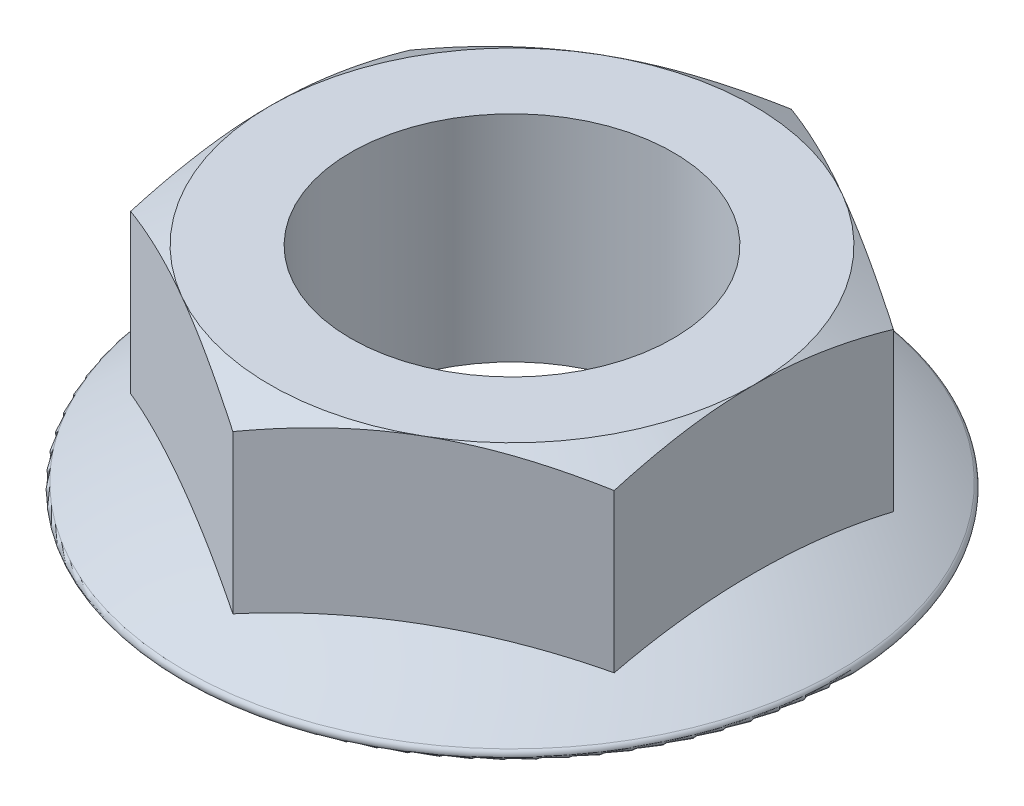
ISO-10303-21;
HEADER;
FILE_DESCRIPTION(('STEP AP214'),'2;1');
FILE_NAME('part.step','',(''),(''),'','','');
FILE_SCHEMA(('AUTOMOTIVE_DESIGN { 1 0 10303 214 1 1 1 1 }'));
ENDSEC;
DATA;
#1=APPLICATION_CONTEXT('core data for automotive mechanical design processes');
#2=APPLICATION_PROTOCOL_DEFINITION('international standard','automotive_design',2000,#1);
#3=PRODUCT_CONTEXT('',#1,'mechanical');
#4=PRODUCT('Part','Part','',(#3));
#5=PRODUCT_RELATED_PRODUCT_CATEGORY('part','',(#4));
#6=PRODUCT_DEFINITION_FORMATION('','',#4);
#7=PRODUCT_DEFINITION_CONTEXT('part definition',#1,'design');
#8=PRODUCT_DEFINITION('design','',#6,#7);
#9=PRODUCT_DEFINITION_SHAPE('','',#8);
#10=(LENGTH_UNIT() NAMED_UNIT(*) SI_UNIT(.MILLI.,.METRE.));
#11=(NAMED_UNIT(*) PLANE_ANGLE_UNIT() SI_UNIT($,.RADIAN.));
#12=(NAMED_UNIT(*) SI_UNIT($,.STERADIAN.) SOLID_ANGLE_UNIT());
#13=UNCERTAINTY_MEASURE_WITH_UNIT(LENGTH_MEASURE(1.E-05),#10,'distance_accuracy_value','');
#14=(GEOMETRIC_REPRESENTATION_CONTEXT(3) GLOBAL_UNCERTAINTY_ASSIGNED_CONTEXT((#13)) GLOBAL_UNIT_ASSIGNED_CONTEXT((#10,
#11,#12)) REPRESENTATION_CONTEXT('',''));
#15=CARTESIAN_POINT('',(0.,0.,0.));
#16=DIRECTION('',(0.,0.,1.));
#17=DIRECTION('',(1.,0.,0.));
#18=AXIS2_PLACEMENT_3D('',#15,#16,#17);
#19=CARTESIAN_POINT('',(-22.4999999999999,20.,12.9903810567669));
#20=DIRECTION('',(0.499999999999995,0.,-0.866025403784441));
#21=DIRECTION('',(-0.866025403784441,0.,-0.499999999999995));
#22=AXIS2_PLACEMENT_3D('',#19,#20,#21);
#23=PLANE('',#22);
#24=CARTESIAN_POINT('',(-22.5001999999999,17.9903143896555,12.990265586713));
#25=CARTESIAN_POINT('',(-22.0056596846795,18.1551492707593,13.2757885708883));
#26=CARTESIAN_POINT('',(-21.5091903987604,18.3125041584607,13.5624252467581));
#27=CARTESIAN_POINT('',(-20.512270737912,18.6101747825265,14.1379970813094));
#28=CARTESIAN_POINT('',(-20.0118191109476,18.7504849147612,14.4269329628537));
#29=CARTESIAN_POINT('',(-19.0059568955597,19.0121827394149,15.0076677836755));
#30=CARTESIAN_POINT('',(-18.5005374245994,19.1335252438812,15.2994718512881));
#31=CARTESIAN_POINT('',(-17.4862080086851,19.3546738156916,15.8850952126132));
#32=CARTESIAN_POINT('',(-16.9772984166631,19.4544820284597,16.1789143025603));
#33=CARTESIAN_POINT('',(-15.9689969145759,19.6283253044473,16.7610574462146));
#34=CARTESIAN_POINT('',(-15.4696797954965,19.7029352669185,17.0493383193261));
#35=CARTESIAN_POINT('',(-14.4687576454326,19.8280391846674,17.6272209921033));
#36=CARTESIAN_POINT('',(-13.9671525705958,19.8785326757383,17.9168228170872));
#37=CARTESIAN_POINT('',(-12.9630998176581,19.954128715289,18.4965129442764));
#38=CARTESIAN_POINT('',(-12.4606538548353,19.9792614354897,18.7866002561654));
#39=CARTESIAN_POINT('',(-11.4552982591452,20.0035954599864,19.3670425799683));
#40=CARTESIAN_POINT('',(-10.9523886410859,20.0027975655861,19.6573975833329));
#41=CARTESIAN_POINT('',(-10.0121905167877,19.9770814657185,20.200221223488));
#42=CARTESIAN_POINT('',(-9.57483504956026,19.9552991118006,20.4527285202234));
#43=CARTESIAN_POINT('',(-8.70116824358604,19.892536574804,20.9571402858346));
#44=CARTESIAN_POINT('',(-8.26485688997443,19.8515566666916,21.2090447632928));
#45=CARTESIAN_POINT('',(-7.39343951507723,19.7511092481864,21.7121578192662));
#46=CARTESIAN_POINT('',(-6.95833494415003,19.6916250199365,21.9633655604166));
#47=CARTESIAN_POINT('',(-6.09020916212544,19.5552217340813,22.464578214359));
#48=CARTESIAN_POINT('',(-5.6571879422089,19.4783027503464,22.7145831322426));
#49=CARTESIAN_POINT('',(-4.34262771135145,19.2194196562896,23.4735448353941));
#50=CARTESIAN_POINT('',(-3.46482360522337,19.011627893702,23.9803452723629));
#51=CARTESIAN_POINT('',(-2.15781149074756,18.6578721503226,24.7349490684896));
#52=CARTESIAN_POINT('',(-1.72413098376757,18.5330695175296,24.9853346259368));
#53=CARTESIAN_POINT('',(-0.859769681101053,18.2708295210671,25.4843738567084));
#54=CARTESIAN_POINT('',(-0.429088076540874,18.1333957185273,25.7330279970363));
#55=CARTESIAN_POINT('',(0.000199999999999925,17.9903143896555,25.980877583587));
#56=B_SPLINE_CURVE_WITH_KNOTS('',3,(#24,#25,#26,#27,#28,#29,#30,#31,#32,#33,#34,#35,#36,#37,#38,
#39,#40,#41,#42,#43,#44,#45,#46,#47,#48,#49,#50,#51,#52,#53,#54,#55),.UNSPECIFIED.,.F.,.F.,(4,2,
2,2,2,2,2,2,2,2,2,2,2,2,2,4),(0.,1.78312722203929,3.56683913913433,5.35473780165091,
7.14245825659311,8.88609109738607,10.6297574992032,12.3713470058018,14.1128826941264,
15.6289689473497,17.1450334863601,18.6624717220613,20.1799035285481,23.2816076138778,
24.8297579454586,26.3774731352148),.UNSPECIFIED.);
#57=CARTESIAN_POINT('',(-22.4999999999999,17.9903810567666,12.9903810567669));
#58=VERTEX_POINT('',#57);
#59=CARTESIAN_POINT('',(-11.2499999999999,20.,19.48557158515));
#60=VERTEX_POINT('',#59);
#61=EDGE_CURVE('E214',#58,#60,#56,.T.);
#62=ORIENTED_EDGE('',*,*,#61,.F.);
#63=DIRECTION('',(0.,-1.,0.));
#64=VECTOR('',#63,1.);
#65=CARTESIAN_POINT('',(-22.4999999999999,20.,12.9903810567669));
#66=LINE('',#65,#64);
#67=CARTESIAN_POINT('',(-22.4999999999999,3.29746895120064,12.9903810567669));
#68=VERTEX_POINT('',#67);
#69=EDGE_CURVE('E237',#58,#68,#66,.T.);
#70=ORIENTED_EDGE('',*,*,#69,.T.);
#71=CARTESIAN_POINT('',(-11.2499999999999,-50.7858001807592,19.48557158515));
#72=DIRECTION('',(0.499999999999995,0.,-0.866025403784441));
#73=DIRECTION('',(-0.866025403784441,0.,-0.499999999999995));
#74=AXIS2_PLACEMENT_3D('',#71,#72,#73);
#75=CIRCLE('',#74,55.6214886532174);
#76=CARTESIAN_POINT('',(0.,3.29746895120063,25.9807621135332));
#77=VERTEX_POINT('',#76);
#78=EDGE_CURVE('E234',#77,#68,#75,.F.);
#79=ORIENTED_EDGE('',*,*,#78,.F.);
#80=DIRECTION('',(0.,-1.,0.));
#81=VECTOR('',#80,1.);
#82=CARTESIAN_POINT('',(0.,20.,25.9807621135332));
#83=LINE('',#82,#81);
#84=CARTESIAN_POINT('',(0.,17.9903810567666,25.9807621135332));
#85=VERTEX_POINT('',#84);
#86=EDGE_CURVE('E246',#85,#77,#83,.T.);
#87=ORIENTED_EDGE('',*,*,#86,.F.);
#88=EDGE_CURVE('E208',#60,#85,#56,.T.);
#89=ORIENTED_EDGE('',*,*,#88,.F.);
#90=EDGE_LOOP('',(#62,#70,#79,#87,#89));
#91=FACE_BOUND('',#90,.T.);
#92=ADVANCED_FACE('F37',(#91),#23,.F.);
#93=CARTESIAN_POINT('',(0.,20.,25.9807621135332));
#94=DIRECTION('',(-0.500000000000001,0.,-0.866025403784438));
#95=DIRECTION('',(-0.866025403784438,0.,0.500000000000001));
#96=AXIS2_PLACEMENT_3D('',#93,#94,#95);
#97=PLANE('',#96);
#98=CARTESIAN_POINT('',(-0.000200000000000414,17.9903143896555,25.980877583587));
#99=CARTESIAN_POINT('',(0.494340315320355,18.1551492707593,25.6953545994117));
#100=CARTESIAN_POINT('',(0.990809601239474,18.3125041584607,25.4087179235419));
#101=CARTESIAN_POINT('',(1.98772926208786,18.6101747825265,24.8331460889907));
#102=CARTESIAN_POINT('',(2.48818088905228,18.7504849147612,24.5442102074464));
#103=CARTESIAN_POINT('',(3.49404310444017,19.0121827394149,23.9634753866245));
#104=CARTESIAN_POINT('',(3.99946257540047,19.1335252438812,23.6716713190119));
#105=CARTESIAN_POINT('',(5.01379199131473,19.3546738156916,23.0860479576868));
#106=CARTESIAN_POINT('',(5.52270158333676,19.4544820284597,22.7922288677397));
#107=CARTESIAN_POINT('',(6.53100308542396,19.6283253044474,22.2100857240854));
#108=CARTESIAN_POINT('',(7.03032020450329,19.7029352669186,21.9218048509739));
#109=CARTESIAN_POINT('',(8.03124235456724,19.8280391846674,21.3439221781966));
#110=CARTESIAN_POINT('',(8.53284742940406,19.8785326757383,21.0543203532127));
#111=CARTESIAN_POINT('',(9.53690018234171,19.954128715289,20.4746302260236));
#112=CARTESIAN_POINT('',(10.0393461451645,19.9792614354898,20.1845429141346));
#113=CARTESIAN_POINT('',(11.0447017408546,20.0035954599864,19.6041005903316));
#114=CARTESIAN_POINT('',(11.5476113589139,20.0027975655861,19.313745586967));
#115=CARTESIAN_POINT('',(12.4878094832121,19.9770814657186,18.7709219468119));
#116=CARTESIAN_POINT('',(12.9251649504396,19.9552991118006,18.5184146500766));
#117=CARTESIAN_POINT('',(13.7988317564138,19.8925365748041,18.0140028844653));
#118=CARTESIAN_POINT('',(14.2351431100254,19.8515566666916,17.7620984070071));
#119=CARTESIAN_POINT('',(15.1065604849226,19.7511092481865,17.2589853510337));
#120=CARTESIAN_POINT('',(15.5416650558499,19.6916250199366,17.0077776098832));
#121=CARTESIAN_POINT('',(16.4097908378745,19.5552217340814,16.5065649559409));
#122=CARTESIAN_POINT('',(16.842812057791,19.4783027503465,16.2565600380572));
#123=CARTESIAN_POINT('',(18.1573722886485,19.2194196562897,15.4975983349057));
#124=CARTESIAN_POINT('',(19.0351763947766,19.0116278937021,14.9907978979369));
#125=CARTESIAN_POINT('',(20.3421885092524,18.6578721503226,14.2361941018101));
#126=CARTESIAN_POINT('',(20.7758690162324,18.5330695175296,13.9858085443629));
#127=CARTESIAN_POINT('',(21.640230318899,18.2708295210671,13.4867693135913));
#128=CARTESIAN_POINT('',(22.0709119234592,18.1333957185273,13.2381151732635));
#129=CARTESIAN_POINT('',(22.5002,17.9903143896555,12.9902655867127));
#130=B_SPLINE_CURVE_WITH_KNOTS('',3,(#98,#99,#100,#101,#102,#103,#104,#105,#106,#107,#108,#109,
#110,#111,#112,#113,#114,#115,#116,#117,#118,#119,#120,#121,#122,#123,#124,#125,#126,#127,#128,
#129),.UNSPECIFIED.,.F.,.F.,(4,2,2,2,2,2,2,2,2,2,2,2,2,2,2,4),(0.,1.78312722203929,
3.56683913913433,5.35473780165091,7.14245825659312,8.88609109738608,10.6297574992032,
12.3713470058018,14.1128826941264,15.6289689473497,17.1450334863602,18.6624717220614,
20.1799035285482,23.281607613878,24.8297579454588,26.3774731352151),.UNSPECIFIED.);
#131=CARTESIAN_POINT('',(11.25,20.,19.4855715851499));
#132=VERTEX_POINT('',#131);
#133=EDGE_CURVE('E215',#85,#132,#130,.T.);
#134=ORIENTED_EDGE('',*,*,#133,.F.);
#135=ORIENTED_EDGE('',*,*,#86,.T.);
#136=CARTESIAN_POINT('',(11.25,-50.7858001807592,19.4855715851499));
#137=DIRECTION('',(-0.500000000000001,0.,-0.866025403784438));
#138=DIRECTION('',(-0.866025403784438,0.,0.500000000000001));
#139=AXIS2_PLACEMENT_3D('',#136,#137,#138);
#140=CIRCLE('',#139,55.6214886532175);
#141=CARTESIAN_POINT('',(22.5,3.29746895120064,12.9903810567665));
#142=VERTEX_POINT('',#141);
#143=EDGE_CURVE('E231',#142,#77,#140,.F.);
#144=ORIENTED_EDGE('',*,*,#143,.F.);
#145=DIRECTION('',(0.,-1.,0.));
#146=VECTOR('',#145,1.);
#147=CARTESIAN_POINT('',(22.5,20.,12.9903810567665));
#148=LINE('',#147,#146);
#149=CARTESIAN_POINT('',(22.5,17.9903810567666,12.9903810567665));
#150=VERTEX_POINT('',#149);
#151=EDGE_CURVE('E244',#150,#142,#148,.T.);
#152=ORIENTED_EDGE('',*,*,#151,.F.);
#153=EDGE_CURVE('E113',#132,#150,#130,.T.);
#154=ORIENTED_EDGE('',*,*,#153,.F.);
#155=EDGE_LOOP('',(#134,#135,#144,#152,#154));
#156=FACE_BOUND('',#155,.T.);
#157=ADVANCED_FACE('F198',(#156),#97,.F.);
#158=CARTESIAN_POINT('',(22.5,20.,12.9903810567665));
#159=DIRECTION('',(-1.,0.,0.));
#160=DIRECTION('',(0.,0.,1.));
#161=AXIS2_PLACEMENT_3D('',#158,#159,#160);
#162=PLANE('',#161);
#163=CARTESIAN_POINT('',(22.5000000000001,6.89447302354354,39.2012659009289));
#164=CARTESIAN_POINT('',(22.5000000000001,7.12914374839976,38.7326063517067));
#165=CARTESIAN_POINT('',(22.5000000000001,7.36298528568569,38.2635317742239));
#166=CARTESIAN_POINT('',(22.5000000000001,7.82884484088587,37.324475456616));
#167=CARTESIAN_POINT('',(22.5000000000001,8.06086285050921,36.8544937123783));
#168=CARTESIAN_POINT('',(22.5000000000001,8.75395933441697,35.4430201100812));
#169=CARTESIAN_POINT('',(22.5000000000001,9.2120511158748,34.5000579924917));
#170=CARTESIAN_POINT('',(22.5000000000001,10.1195219140132,32.6076206134375));
#171=CARTESIAN_POINT('',(22.5000000000001,10.5688816436513,31.6581360899649));
#172=CARTESIAN_POINT('',(22.5000000000001,11.4557984662581,29.7536822786456));
#173=CARTESIAN_POINT('',(22.5000000000001,11.8933557888495,28.7987130979451));
#174=CARTESIAN_POINT('',(22.5000000000001,12.7733931909626,26.8388984174315));
#175=CARTESIAN_POINT('',(22.5000000000001,13.2152012977708,25.8337501106428));
#176=CARTESIAN_POINT('',(22.5000000000001,14.078861229095,23.8148367246343));
#177=CARTESIAN_POINT('',(22.5000000000001,14.5007121637488,22.8010712635608));
#178=CARTESIAN_POINT('',(22.5000000000001,15.3188053045396,20.763901390335));
#179=CARTESIAN_POINT('',(22.5000000000001,15.7150631993151,19.7405033324654));
#180=CARTESIAN_POINT('',(22.5000000000001,16.285046273736,18.1964455191699));
#181=CARTESIAN_POINT('',(22.5000000000001,16.4709682698331,17.6802813140632));
#182=CARTESIAN_POINT('',(22.5000000000001,16.8335743048273,16.6447237121856));
#183=CARTESIAN_POINT('',(22.5000000000001,17.0102585501513,16.1253303878629));
#184=CARTESIAN_POINT('',(22.5000000000001,17.3930100017069,14.9620337792105));
#185=CARTESIAN_POINT('',(22.5000000000001,17.5963686734073,14.3172344124531));
#186=CARTESIAN_POINT('',(22.5,17.9846108957669,13.0221206684808));
#187=CARTESIAN_POINT('',(22.5,18.1694957097501,12.3718066716846));
#188=CARTESIAN_POINT('',(22.5,18.517899320842,11.0654300504597));
#189=CARTESIAN_POINT('',(22.5,18.6814176073789,10.4093672890587));
#190=CARTESIAN_POINT('',(22.5,18.9839373785542,9.09157736515421));
#191=CARTESIAN_POINT('',(22.5,19.122939000728,8.42985023444886));
#192=CARTESIAN_POINT('',(22.5,19.3710856903724,7.11242504428103));
#193=CARTESIAN_POINT('',(22.5,19.4806980343357,6.45681565540037));
#194=CARTESIAN_POINT('',(22.5,19.6702538270543,5.14129429853986));
#195=CARTESIAN_POINT('',(22.5,19.7501977719773,4.48138240270202));
#196=CARTESIAN_POINT('',(22.5,19.8780163149671,3.15866752098902));
#197=CARTESIAN_POINT('',(22.5,19.9259023467056,2.49586565082386));
#198=CARTESIAN_POINT('',(22.5,19.9880937561756,1.16867671671507));
#199=CARTESIAN_POINT('',(22.5,20.0023993596772,0.504289663459104));
#200=CARTESIAN_POINT('',(22.5,19.9969265870006,-0.828469862735748));
#201=CARTESIAN_POINT('',(22.5,19.9769360035556,-1.49684146438049));
#202=CARTESIAN_POINT('',(22.5,19.9031473264879,-2.83170319627016));
#203=CARTESIAN_POINT('',(22.5,19.8493488577433,-3.4981933055562));
#204=CARTESIAN_POINT('',(22.5,19.7096672644789,-4.82802937230649));
#205=CARTESIAN_POINT('',(22.5,19.623771800111,-5.49137402102623));
#206=CARTESIAN_POINT('',(22.5,19.4224352567518,-6.8135342804542));
#207=CARTESIAN_POINT('',(22.5,19.3069937129083,-7.47234981973791));
#208=CARTESIAN_POINT('',(22.5,19.0473178311132,-8.79609915784154));
#209=CARTESIAN_POINT('',(22.5,18.9026193565819,-9.46094124076681));
#210=CARTESIAN_POINT('',(22.5,18.5890092858376,-10.7848528361774));
#211=CARTESIAN_POINT('',(22.5,18.4200975625287,-11.4439223183429));
#212=CARTESIAN_POINT('',(22.5,18.0612404345634,-12.7562444082694));
#213=CARTESIAN_POINT('',(22.5,17.8712960401261,-13.4094972937801));
#214=CARTESIAN_POINT('',(22.5,17.4732552915609,-14.7104641783256));
#215=CARTESIAN_POINT('',(22.5,17.2651577554918,-15.3581778136836));
#216=CARTESIAN_POINT('',(22.4999999999999,16.7069013463487,-17.026493651587));
#217=CARTESIAN_POINT('',(22.4999999999999,16.344963188306,-18.0431529174112));
#218=CARTESIAN_POINT('',(22.4999999999999,15.590550301512,-20.06507272362));
#219=CARTESIAN_POINT('',(22.4999999999999,15.198072645579,-21.0703321607356));
#220=CARTESIAN_POINT('',(22.4999999999999,14.3889330191361,-23.0716719323577));
#221=CARTESIAN_POINT('',(22.4999999999999,13.9722578648794,-24.0677469137913));
#222=CARTESIAN_POINT('',(22.4999999999999,13.1199599740864,-26.051676740157));
#223=CARTESIAN_POINT('',(22.4999999999999,12.6843379849917,-27.0395319075278));
#224=CARTESIAN_POINT('',(22.4999999999999,11.8168554631673,-28.9664014007348));
#225=CARTESIAN_POINT('',(22.4999999999999,11.3856274225723,-29.9057013144492));
#226=CARTESIAN_POINT('',(22.4999999999999,10.511855774683,-31.7790329399893));
#227=CARTESIAN_POINT('',(22.4999999999999,10.0693119663585,-32.7130645578607));
#228=CARTESIAN_POINT('',(22.4999999999999,9.17573901967872,-34.5749736426784));
#229=CARTESIAN_POINT('',(22.4999999999999,8.72472669715075,-35.5028591907351));
#230=CARTESIAN_POINT('',(22.4999999999999,8.04245282108951,-36.8918203683816));
#231=CARTESIAN_POINT('',(22.4999999999999,7.81407562130576,-37.3543162966075));
#232=CARTESIAN_POINT('',(22.4999999999999,7.3555576872842,-38.2784307862429));
#233=CARTESIAN_POINT('',(22.4999999999999,7.12541696063687,-38.7400493514182));
#234=CARTESIAN_POINT('',(22.4999999999999,6.89447302354353,-39.2012659009291));
#235=B_SPLINE_CURVE_WITH_KNOTS('',3,(#163,#164,#165,#166,#167,#168,#169,#170,#171,#172,#173,
#174,#175,#176,#177,#178,#179,#180,#181,#182,#183,#184,#185,#186,#187,#188,#189,#190,#191,#192,
#193,#194,#195,#196,#197,#198,#199,#200,#201,#202,#203,#204,#205,#206,#207,#208,#209,#210,#211,
#212,#213,#214,#215,#216,#217,#218,#219,#220,#221,#222,#223,#224,#225,#226,#227,#228,#229,#230,
#231,#232,#233,#234),.UNSPECIFIED.,.F.,.F.,(4,2,2,2,2,2,2,2,2,2,2,2,2,2,2,2,2,2,2,2,2,2,2,2,2,2,
2,2,2,2,2,2,2,2,2,4),(0.,1.57238809791579,3.14478334076758,6.28976885250641,9.4410530266791,
12.5922758465328,15.885982536837,19.1798359507367,22.4716506699483,24.1174620164353,
25.7632365698799,27.7913162201474,29.819257086307,31.8472464030127,33.8752243425853,
35.868735813609,37.8622139440886,39.8549807077845,41.8477340735398,43.8528620927906,
45.8580123607161,47.8639343130009,49.8698878266466,51.9105905892238,53.9513040638737,
55.9919195636038,58.0326680260314,61.2694713568812,64.5065853153033,67.74547983608,
70.9842467000447,74.0848305099607,77.18546944163,80.2804938924524,81.8279170225351,
83.375333496025),.UNSPECIFIED.);
#236=CARTESIAN_POINT('',(22.5,20.,0.));
#237=VERTEX_POINT('',#236);
#238=EDGE_CURVE('E109',#150,#237,#235,.T.);
#239=ORIENTED_EDGE('',*,*,#238,.F.);
#240=ORIENTED_EDGE('',*,*,#151,.T.);
#241=CARTESIAN_POINT('',(22.5,-50.7858001807592,0.));
#242=DIRECTION('',(-1.,0.,0.));
#243=DIRECTION('',(0.,0.,1.));
#244=AXIS2_PLACEMENT_3D('',#241,#242,#243);
#245=CIRCLE('',#244,55.6214886532175);
#246=CARTESIAN_POINT('',(22.5,3.29746895120064,-12.9903810567667));
#247=VERTEX_POINT('',#246);
#248=EDGE_CURVE('E228',#247,#142,#245,.F.);
#249=ORIENTED_EDGE('',*,*,#248,.F.);
#250=DIRECTION('',(0.,-1.,0.));
#251=VECTOR('',#250,1.);
#252=CARTESIAN_POINT('',(22.5,20.,-12.9903810567667));
#253=LINE('',#252,#251);
#254=CARTESIAN_POINT('',(22.5,17.9903810567666,-12.9903810567667));
#255=VERTEX_POINT('',#254);
#256=EDGE_CURVE('E133',#255,#247,#253,.T.);
#257=ORIENTED_EDGE('',*,*,#256,.F.);
#258=EDGE_CURVE('E117',#237,#255,#235,.T.);
#259=ORIENTED_EDGE('',*,*,#258,.F.);
#260=EDGE_LOOP('',(#239,#240,#249,#257,#259));
#261=FACE_BOUND('',#260,.T.);
#262=ADVANCED_FACE('F131',(#261),#162,.F.);
#263=CARTESIAN_POINT('',(22.5,20.,-12.9903810567667));
#264=DIRECTION('',(-0.499999999999995,0.,0.866025403784442));
#265=DIRECTION('',(0.866025403784442,0.,0.499999999999995));
#266=AXIS2_PLACEMENT_3D('',#263,#264,#265);
#267=PLANE('',#266);
#268=CARTESIAN_POINT('',(22.5002,17.9903143896555,-12.9902655867129));
#269=CARTESIAN_POINT('',(22.0056596846796,18.1551492707593,-13.2757885708882));
#270=CARTESIAN_POINT('',(21.5091903987605,18.3125041584607,-13.562425246758));
#271=CARTESIAN_POINT('',(20.5122707379121,18.6101747825265,-14.1379970813092));
#272=CARTESIAN_POINT('',(20.0118191109477,18.7504849147612,-14.4269329628535));
#273=CARTESIAN_POINT('',(19.0059568955598,19.0121827394149,-15.0076677836754));
#274=CARTESIAN_POINT('',(18.5005374245995,19.1335252438812,-15.299471851288));
#275=CARTESIAN_POINT('',(17.4862080086852,19.3546738156916,-15.885095212613));
#276=CARTESIAN_POINT('',(16.9772984166632,19.4544820284597,-16.1789143025601));
#277=CARTESIAN_POINT('',(15.968996914576,19.6283253044474,-16.7610574462145));
#278=CARTESIAN_POINT('',(15.4696797954966,19.7029352669186,-17.0493383193259));
#279=CARTESIAN_POINT('',(14.4687576454327,19.8280391846674,-17.6272209921032));
#280=CARTESIAN_POINT('',(13.9671525705959,19.8785326757383,-17.9168228170871));
#281=CARTESIAN_POINT('',(12.9630998176582,19.954128715289,-18.4965129442762));
#282=CARTESIAN_POINT('',(12.4606538548354,19.9792614354898,-18.7866002561652));
#283=CARTESIAN_POINT('',(11.4552982591453,20.0035954599864,-19.3670425799682));
#284=CARTESIAN_POINT('',(10.952388641086,20.0027975655861,-19.6573975833327));
#285=CARTESIAN_POINT('',(10.0121905167878,19.9770814657186,-20.2002212234879));
#286=CARTESIAN_POINT('',(9.57483504956033,19.9552991118006,-20.4527285202232));
#287=CARTESIAN_POINT('',(8.70116824358609,19.8925365748041,-20.9571402858345));
#288=CARTESIAN_POINT('',(8.26485688997447,19.8515566666916,-21.2090447632926));
#289=CARTESIAN_POINT('',(7.39343951507725,19.7511092481865,-21.7121578192661));
#290=CARTESIAN_POINT('',(6.95833494415004,19.6916250199366,-21.9633655604165));
#291=CARTESIAN_POINT('',(6.09020916212542,19.5552217340814,-22.4645782143589));
#292=CARTESIAN_POINT('',(5.65718794220886,19.4783027503465,-22.7145831322425));
#293=CARTESIAN_POINT('',(4.34262771135139,19.2194196562897,-23.4735448353941));
#294=CARTESIAN_POINT('',(3.46482360522328,19.0116278937021,-23.9803452723629));
#295=CARTESIAN_POINT('',(2.15781149074744,18.6578721503227,-24.7349490684896));
#296=CARTESIAN_POINT('',(1.72413098376743,18.5330695175296,-24.9853346259368));
#297=CARTESIAN_POINT('',(0.859769681100895,18.2708295210671,-25.4843738567084));
#298=CARTESIAN_POINT('',(0.429088076540706,18.1333957185273,-25.7330279970362));
#299=CARTESIAN_POINT('',(-0.000200000000179531,17.9903143896555,-25.980877583587));
#300=B_SPLINE_CURVE_WITH_KNOTS('',3,(#268,#269,#270,#271,#272,#273,#274,#275,#276,#277,#278,
#279,#280,#281,#282,#283,#284,#285,#286,#287,#288,#289,#290,#291,#292,#293,#294,#295,#296,#297,
#298,#299),.UNSPECIFIED.,.F.,.F.,(4,2,2,2,2,2,2,2,2,2,2,2,2,2,2,4),(0.,1.78312722203929,
3.56683913913434,5.35473780165091,7.14245825659312,8.88609109738608,10.6297574992032,
12.3713470058018,14.1128826941264,15.6289689473497,17.1450334863602,18.6624717220614,
20.1799035285482,23.281607613878,24.8297579454588,26.3774731352151),.UNSPECIFIED.);
#301=CARTESIAN_POINT('',(11.2499999999999,20.,-19.48557158515));
#302=VERTEX_POINT('',#301);
#303=EDGE_CURVE('E122',#255,#302,#300,.T.);
#304=ORIENTED_EDGE('',*,*,#303,.F.);
#305=ORIENTED_EDGE('',*,*,#256,.T.);
#306=CARTESIAN_POINT('',(11.2499999999999,-50.7858001807592,-19.4855715851499));
#307=DIRECTION('',(-0.499999999999995,0.,0.866025403784442));
#308=DIRECTION('',(0.866025403784442,0.,0.499999999999995));
#309=AXIS2_PLACEMENT_3D('',#306,#307,#308);
#310=CIRCLE('',#309,55.6214886532175);
#311=CARTESIAN_POINT('',(-1.82145964977565E-13,3.29746895120064,-25.9807621135332));
#312=VERTEX_POINT('',#311);
#313=EDGE_CURVE('E225',#312,#247,#310,.F.);
#314=ORIENTED_EDGE('',*,*,#313,.F.);
#315=DIRECTION('',(0.,-1.,0.));
#316=VECTOR('',#315,1.);
#317=CARTESIAN_POINT('',(-1.81422692176648E-13,20.,-25.9807621135332));
#318=LINE('',#317,#316);
#319=CARTESIAN_POINT('',(-1.81740793973779E-13,17.9903810567666,-25.9807621135332));
#320=VERTEX_POINT('',#319);
#321=EDGE_CURVE('E241',#320,#312,#318,.T.);
#322=ORIENTED_EDGE('',*,*,#321,.F.);
#323=EDGE_CURVE('E134',#302,#320,#300,.T.);
#324=ORIENTED_EDGE('',*,*,#323,.F.);
#325=EDGE_LOOP('',(#304,#305,#314,#322,#324));
#326=FACE_BOUND('',#325,.T.);
#327=ADVANCED_FACE('F188',(#326),#267,.F.);
#328=CARTESIAN_POINT('',(-1.81422692176648E-13,20.,-25.9807621135332));
#329=DIRECTION('',(0.500000000000007,0.,0.866025403784435));
#330=DIRECTION('',(0.866025403784435,0.,-0.500000000000007));
#331=AXIS2_PLACEMENT_3D('',#328,#329,#330);
#332=PLANE('',#331);
#333=CARTESIAN_POINT('',(0.000199999999818577,17.9903143896555,-25.980877583587));
#334=CARTESIAN_POINT('',(-0.494340315320535,18.1551492707593,-25.6953545994117));
#335=CARTESIAN_POINT('',(-0.990809601239653,18.3125041584607,-25.4087179235419));
#336=CARTESIAN_POINT('',(-1.98772926208803,18.6101747825265,-24.8331460889906));
#337=CARTESIAN_POINT('',(-2.48818088905246,18.7504849147612,-24.5442102074463));
#338=CARTESIAN_POINT('',(-3.49404310444034,19.0121827394149,-23.9634753866245));
#339=CARTESIAN_POINT('',(-3.99946257540063,19.1335252438812,-23.6716713190118));
#340=CARTESIAN_POINT('',(-5.01379199131489,19.3546738156916,-23.0860479576868));
#341=CARTESIAN_POINT('',(-5.52270158333692,19.4544820284597,-22.7922288677397));
#342=CARTESIAN_POINT('',(-6.53100308542411,19.6283253044474,-22.2100857240853));
#343=CARTESIAN_POINT('',(-7.03032020450344,19.7029352669186,-21.9218048509739));
#344=CARTESIAN_POINT('',(-8.03124235456739,19.8280391846674,-21.3439221781966));
#345=CARTESIAN_POINT('',(-8.5328474294042,19.8785326757383,-21.0543203532127));
#346=CARTESIAN_POINT('',(-9.53690018234185,19.954128715289,-20.4746302260235));
#347=CARTESIAN_POINT('',(-10.0393461451646,19.9792614354898,-20.1845429141345));
#348=CARTESIAN_POINT('',(-11.0447017408547,20.0035954599864,-19.6041005903316));
#349=CARTESIAN_POINT('',(-11.547611358914,20.0027975655861,-19.313745586967));
#350=CARTESIAN_POINT('',(-12.4878094832122,19.9770814657186,-18.7709219468118));
#351=CARTESIAN_POINT('',(-12.9251649504397,19.9552991118006,-18.5184146500765));
#352=CARTESIAN_POINT('',(-13.7988317564139,19.8925365748041,-18.0140028844652));
#353=CARTESIAN_POINT('',(-14.2351431100256,19.8515566666916,-17.762098407007));
#354=CARTESIAN_POINT('',(-15.1065604849228,19.7511092481865,-17.2589853510336));
#355=CARTESIAN_POINT('',(-15.54166505585,19.6916250199366,-17.0077776098831));
#356=CARTESIAN_POINT('',(-16.4097908378746,19.5552217340814,-16.5065649559408));
#357=CARTESIAN_POINT('',(-16.8428120577911,19.4783027503465,-16.2565600380571));
#358=CARTESIAN_POINT('',(-18.1573722886486,19.2194196562897,-15.4975983349056));
#359=CARTESIAN_POINT('',(-19.0351763947767,19.0116278937021,-14.9907978979367));
#360=CARTESIAN_POINT('',(-20.3421885092525,18.6578721503227,-14.23619410181));
#361=CARTESIAN_POINT('',(-20.7758690162325,18.5330695175296,-13.9858085443628));
#362=CARTESIAN_POINT('',(-21.6402303188991,18.2708295210671,-13.4867693135912));
#363=CARTESIAN_POINT('',(-22.0709119234592,18.1333957185273,-13.2381151732633));
#364=CARTESIAN_POINT('',(-22.5002000000001,17.9903143896555,-12.9902655867125));
#365=B_SPLINE_CURVE_WITH_KNOTS('',3,(#333,#334,#335,#336,#337,#338,#339,#340,#341,#342,#343,
#344,#345,#346,#347,#348,#349,#350,#351,#352,#353,#354,#355,#356,#357,#358,#359,#360,#361,#362,
#363,#364),.UNSPECIFIED.,.F.,.F.,(4,2,2,2,2,2,2,2,2,2,2,2,2,2,2,4),(0.,1.78312722203929,
3.56683913913433,5.35473780165091,7.14245825659311,8.88609109738607,10.6297574992032,
12.3713470058018,14.1128826941264,15.6289689473497,17.1450334863602,18.6624717220614,
20.1799035285482,23.281607613878,24.8297579454588,26.3774731352151),.UNSPECIFIED.);
#366=CARTESIAN_POINT('',(-11.2500000000002,20.,-19.4855715851498));
#367=VERTEX_POINT('',#366);
#368=EDGE_CURVE('E182',#320,#367,#365,.T.);
#369=ORIENTED_EDGE('',*,*,#368,.F.);
#370=ORIENTED_EDGE('',*,*,#321,.T.);
#371=CARTESIAN_POINT('',(-11.2500000000002,-50.7858001807592,-19.4855715851498));
#372=DIRECTION('',(0.500000000000007,0.,0.866025403784435));
#373=DIRECTION('',(0.866025403784435,0.,-0.500000000000007));
#374=AXIS2_PLACEMENT_3D('',#371,#372,#373);
#375=CIRCLE('',#374,55.6214886532175);
#376=CARTESIAN_POINT('',(-22.5000000000001,3.29746895120064,-12.9903810567664));
#377=VERTEX_POINT('',#376);
#378=EDGE_CURVE('E222',#377,#312,#375,.F.);
#379=ORIENTED_EDGE('',*,*,#378,.F.);
#380=DIRECTION('',(0.,-1.,0.));
#381=VECTOR('',#380,1.);
#382=CARTESIAN_POINT('',(-22.5000000000001,20.,-12.9903810567664));
#383=LINE('',#382,#381);
#384=CARTESIAN_POINT('',(-22.5000000000001,17.9903810567666,-12.9903810567664));
#385=VERTEX_POINT('',#384);
#386=EDGE_CURVE('E239',#385,#377,#383,.T.);
#387=ORIENTED_EDGE('',*,*,#386,.F.);
#388=EDGE_CURVE('E175',#367,#385,#365,.T.);
#389=ORIENTED_EDGE('',*,*,#388,.F.);
#390=EDGE_LOOP('',(#369,#370,#379,#387,#389));
#391=FACE_BOUND('',#390,.T.);
#392=ADVANCED_FACE('F184',(#391),#332,.F.);
#393=CARTESIAN_POINT('',(-22.5000000000001,20.,-12.9903810567664));
#394=DIRECTION('',(1.,0.,0.));
#395=DIRECTION('',(0.,0.,-1.));
#396=AXIS2_PLACEMENT_3D('',#393,#394,#395);
#397=PLANE('',#396);
#398=CARTESIAN_POINT('',(-22.5000000000004,6.89447302354354,-39.2012659009288));
#399=CARTESIAN_POINT('',(-22.5000000000004,7.12914374839976,-38.7326063517066));
#400=CARTESIAN_POINT('',(-22.5000000000004,7.36298528568569,-38.2635317742238));
#401=CARTESIAN_POINT('',(-22.5000000000004,7.82884484088587,-37.3244754566158));
#402=CARTESIAN_POINT('',(-22.5000000000004,8.06086285050922,-36.8544937123782));
#403=CARTESIAN_POINT('',(-22.5000000000004,8.75395933441697,-35.443020110081));
#404=CARTESIAN_POINT('',(-22.5000000000004,9.2120511158748,-34.5000579924915));
#405=CARTESIAN_POINT('',(-22.5000000000003,10.1195219140132,-32.6076206134373));
#406=CARTESIAN_POINT('',(-22.5000000000003,10.5688816436513,-31.6581360899647));
#407=CARTESIAN_POINT('',(-22.5000000000003,11.4557984662581,-29.7536822786454));
#408=CARTESIAN_POINT('',(-22.5000000000003,11.8933557888495,-28.798713097945));
#409=CARTESIAN_POINT('',(-22.5000000000003,12.7733931909626,-26.8388984174314));
#410=CARTESIAN_POINT('',(-22.5000000000003,13.2152012977708,-25.8337501106426));
#411=CARTESIAN_POINT('',(-22.5000000000002,14.078861229095,-23.8148367246341));
#412=CARTESIAN_POINT('',(-22.5000000000002,14.5007121637488,-22.8010712635607));
#413=CARTESIAN_POINT('',(-22.5000000000002,15.3188053045396,-20.7639013903349));
#414=CARTESIAN_POINT('',(-22.5000000000002,15.7150631993152,-19.7405033324653));
#415=CARTESIAN_POINT('',(-22.5000000000002,16.285046273736,-18.1964455191697));
#416=CARTESIAN_POINT('',(-22.5000000000002,16.4709682698331,-17.6802813140631));
#417=CARTESIAN_POINT('',(-22.5000000000002,16.8335743048273,-16.6447237121854));
#418=CARTESIAN_POINT('',(-22.5000000000002,17.0102585501513,-16.1253303878628));
#419=CARTESIAN_POINT('',(-22.5000000000002,17.3930100017069,-14.9620337792103));
#420=CARTESIAN_POINT('',(-22.5000000000001,17.5963686734073,-14.3172344124529));
#421=CARTESIAN_POINT('',(-22.5000000000001,17.9846108957669,-13.0221206684806));
#422=CARTESIAN_POINT('',(-22.5000000000001,18.1694957097501,-12.3718066716845));
#423=CARTESIAN_POINT('',(-22.5000000000001,18.517899320842,-11.0654300504595));
#424=CARTESIAN_POINT('',(-22.5000000000001,18.6814176073789,-10.4093672890586));
#425=CARTESIAN_POINT('',(-22.5000000000001,18.9839373785542,-9.09157736515406));
#426=CARTESIAN_POINT('',(-22.5000000000001,19.122939000728,-8.42985023444871));
#427=CARTESIAN_POINT('',(-22.5000000000001,19.3710856903724,-7.11242504428088));
#428=CARTESIAN_POINT('',(-22.5000000000001,19.4806980343357,-6.45681565540022));
#429=CARTESIAN_POINT('',(-22.5,19.6702538270543,-5.14129429853971));
#430=CARTESIAN_POINT('',(-22.5,19.7501977719773,-4.48138240270186));
#431=CARTESIAN_POINT('',(-22.5,19.8780163149671,-3.15866752098886));
#432=CARTESIAN_POINT('',(-22.5,19.9259023467056,-2.49586565082371));
#433=CARTESIAN_POINT('',(-22.5,19.9880937561756,-1.16867671671492));
#434=CARTESIAN_POINT('',(-22.5,20.0023993596772,-0.504289663458948));
#435=CARTESIAN_POINT('',(-22.5,19.9969265870006,0.828469862735904));
#436=CARTESIAN_POINT('',(-22.5,19.9769360035556,1.49684146438065));
#437=CARTESIAN_POINT('',(-22.5,19.9031473264879,2.83170319627031));
#438=CARTESIAN_POINT('',(-22.5,19.8493488577433,3.49819330555635));
#439=CARTESIAN_POINT('',(-22.5,19.7096672644789,4.82802937230665));
#440=CARTESIAN_POINT('',(-22.4999999999999,19.623771800111,5.49137402102639));
#441=CARTESIAN_POINT('',(-22.4999999999999,19.4224352567518,6.81353428045435));
#442=CARTESIAN_POINT('',(-22.4999999999999,19.3069937129083,7.47234981973806));
#443=CARTESIAN_POINT('',(-22.4999999999999,19.0473178311132,8.79609915784168));
#444=CARTESIAN_POINT('',(-22.4999999999999,18.9026193565819,9.46094124076695));
#445=CARTESIAN_POINT('',(-22.4999999999999,18.5890092858376,10.7848528361775));
#446=CARTESIAN_POINT('',(-22.4999999999999,18.4200975625287,11.4439223183431));
#447=CARTESIAN_POINT('',(-22.4999999999999,18.0612404345634,12.7562444082695));
#448=CARTESIAN_POINT('',(-22.4999999999999,17.8712960401261,13.4094972937802));
#449=CARTESIAN_POINT('',(-22.4999999999998,17.4732552915609,14.7104641783258));
#450=CARTESIAN_POINT('',(-22.4999999999998,17.2651577554918,15.3581778136838));
#451=CARTESIAN_POINT('',(-22.4999999999998,16.7069013463487,17.0264936515872));
#452=CARTESIAN_POINT('',(-22.4999999999998,16.344963188306,18.0431529174113));
#453=CARTESIAN_POINT('',(-22.4999999999998,15.590550301512,20.0650727236202));
#454=CARTESIAN_POINT('',(-22.4999999999998,15.198072645579,21.0703321607358));
#455=CARTESIAN_POINT('',(-22.4999999999998,14.3889330191361,23.0716719323579));
#456=CARTESIAN_POINT('',(-22.4999999999997,13.9722578648794,24.0677469137914));
#457=CARTESIAN_POINT('',(-22.4999999999997,13.1199599740864,26.0516767401571));
#458=CARTESIAN_POINT('',(-22.4999999999997,12.6843379849917,27.0395319075279));
#459=CARTESIAN_POINT('',(-22.4999999999997,11.8168554631673,28.966401400735));
#460=CARTESIAN_POINT('',(-22.4999999999997,11.3856274225723,29.9057013144494));
#461=CARTESIAN_POINT('',(-22.4999999999997,10.511855774683,31.7790329399894));
#462=CARTESIAN_POINT('',(-22.4999999999997,10.0693119663585,32.7130645578608));
#463=CARTESIAN_POINT('',(-22.4999999999996,9.17573901967872,34.5749736426786));
#464=CARTESIAN_POINT('',(-22.4999999999996,8.72472669715075,35.5028591907352));
#465=CARTESIAN_POINT('',(-22.4999999999996,8.04245282108952,36.8918203683817));
#466=CARTESIAN_POINT('',(-22.4999999999996,7.81407562130577,37.3543162966076));
#467=CARTESIAN_POINT('',(-22.4999999999996,7.35555768728421,38.2784307862431));
#468=CARTESIAN_POINT('',(-22.4999999999996,7.12541696063687,38.7400493514183));
#469=CARTESIAN_POINT('',(-22.4999999999996,6.89447302354354,39.2012659009292));
#470=B_SPLINE_CURVE_WITH_KNOTS('',3,(#398,#399,#400,#401,#402,#403,#404,#405,#406,#407,#408,
#409,#410,#411,#412,#413,#414,#415,#416,#417,#418,#419,#420,#421,#422,#423,#424,#425,#426,#427,
#428,#429,#430,#431,#432,#433,#434,#435,#436,#437,#438,#439,#440,#441,#442,#443,#444,#445,#446,
#447,#448,#449,#450,#451,#452,#453,#454,#455,#456,#457,#458,#459,#460,#461,#462,#463,#464,#465,
#466,#467,#468,#469),.UNSPECIFIED.,.F.,.F.,(4,2,2,2,2,2,2,2,2,2,2,2,2,2,2,2,2,2,2,2,2,2,2,2,2,2,
2,2,2,2,2,2,2,2,2,4),(0.,1.5723880979158,3.14478334076758,6.28976885250641,9.4410530266791,
12.5922758465328,15.885982536837,19.1798359507367,22.4716506699483,24.1174620164353,
25.7632365698799,27.7913162201474,29.819257086307,31.8472464030127,33.8752243425853,
35.868735813609,37.8622139440886,39.8549807077845,41.8477340735398,43.8528620927906,
45.8580123607161,47.8639343130009,49.8698878266466,51.9105905892238,53.9513040638737,
55.9919195636038,58.0326680260314,61.2694713568812,64.5065853153033,67.74547983608,
70.9842467000447,74.0848305099607,77.18546944163,80.2804938924523,81.8279170225351,
83.375333496025),.UNSPECIFIED.);
#471=CARTESIAN_POINT('',(-22.5,20.,2.34361077402996E-13));
#472=VERTEX_POINT('',#471);
#473=EDGE_CURVE('E183',#385,#472,#470,.T.);
#474=ORIENTED_EDGE('',*,*,#473,.F.);
#475=ORIENTED_EDGE('',*,*,#386,.T.);
#476=CARTESIAN_POINT('',(-22.5,-50.7858001807592,2.27422183499089E-13));
#477=DIRECTION('',(1.,0.,0.));
#478=DIRECTION('',(0.,0.,-1.));
#479=AXIS2_PLACEMENT_3D('',#476,#477,#478);
#480=CIRCLE('',#479,55.6214886532175);
#481=EDGE_CURVE('E248',#68,#377,#480,.F.);
#482=ORIENTED_EDGE('',*,*,#481,.F.);
#483=ORIENTED_EDGE('',*,*,#69,.F.);
#484=EDGE_CURVE('E128',#472,#58,#470,.T.);
#485=ORIENTED_EDGE('',*,*,#484,.F.);
#486=EDGE_LOOP('',(#474,#475,#482,#483,#485));
#487=FACE_BOUND('',#486,.T.);
#488=ADVANCED_FACE('F187',(#487),#397,.F.);
#489=CARTESIAN_POINT('',(0.,20.,0.));
#490=DIRECTION('',(0.,1.,0.));
#491=DIRECTION('',(0.,0.,1.));
#492=AXIS2_PLACEMENT_3D('',#489,#490,#491);
#493=PLANE('',#492);
#494=CARTESIAN_POINT('',(0.,20.,0.));
#495=DIRECTION('',(0.,1.,0.));
#496=DIRECTION('',(0.,0.,1.));
#497=AXIS2_PLACEMENT_3D('',#494,#495,#496);
#498=CIRCLE('',#497,15.);
#499=CARTESIAN_POINT('',(0.,20.,15.));
#500=VERTEX_POINT('',#499);
#501=EDGE_CURVE('E216',#500,#500,#498,.T.);
#502=ORIENTED_EDGE('',*,*,#501,.F.);
#503=EDGE_LOOP('',(#502));
#504=FACE_BOUND('',#503,.T.);
#505=CARTESIAN_POINT('',(0.,20.,0.));
#506=DIRECTION('',(0.,1.,0.));
#507=DIRECTION('',(0.,0.,1.));
#508=AXIS2_PLACEMENT_3D('',#505,#506,#507);
#509=CIRCLE('',#508,22.5);
#510=EDGE_CURVE('E41',#60,#132,#509,.T.);
#511=ORIENTED_EDGE('',*,*,#510,.T.);
#512=CARTESIAN_POINT('',(0.,20.,0.));
#513=DIRECTION('',(0.,1.,0.));
#514=DIRECTION('',(0.,0.,1.));
#515=AXIS2_PLACEMENT_3D('',#512,#513,#514);
#516=CIRCLE('',#515,22.5);
#517=EDGE_CURVE('E53',#132,#237,#516,.T.);
#518=ORIENTED_EDGE('',*,*,#517,.T.);
#519=EDGE_CURVE('E11',#237,#302,#509,.T.);
#520=ORIENTED_EDGE('',*,*,#519,.T.);
#521=EDGE_CURVE('E46',#302,#367,#509,.T.);
#522=ORIENTED_EDGE('',*,*,#521,.T.);
#523=EDGE_CURVE('E61',#367,#472,#509,.T.);
#524=ORIENTED_EDGE('',*,*,#523,.T.);
#525=EDGE_CURVE('E257',#472,#60,#509,.T.);
#526=ORIENTED_EDGE('',*,*,#525,.T.);
#527=EDGE_LOOP('',(#511,#518,#520,#522,#524,#526));
#528=FACE_BOUND('',#527,.T.);
#529=ADVANCED_FACE('F126',(#504,#528),#493,.T.);
#530=CARTESIAN_POINT('',(0.,-50.7858001807592,0.));
#531=DIRECTION('',(0.,1.,0.));
#532=DIRECTION('',(0.,0.,-1.));
#533=AXIS2_PLACEMENT_3D('',#530,#531,#532);
#534=SPHERICAL_SURFACE('',#533,60.);
#535=CARTESIAN_POINT('',(0.,0.930973110762685,0.));
#536=DIRECTION('',(0.,-1.,0.));
#537=DIRECTION('',(0.,0.,-1.));
#538=AXIS2_PLACEMENT_3D('',#535,#536,#537);
#539=CIRCLE('',#538,30.4199829111282);
#540=CARTESIAN_POINT('',(0.,0.930973110762685,-30.4199829111282));
#541=VERTEX_POINT('',#540);
#542=EDGE_CURVE('E251',#541,#541,#539,.F.);
#543=ORIENTED_EDGE('',*,*,#542,.T.);
#544=EDGE_LOOP('',(#543));
#545=FACE_BOUND('',#544,.T.);
#546=ORIENTED_EDGE('',*,*,#143,.T.);
#547=ORIENTED_EDGE('',*,*,#78,.T.);
#548=ORIENTED_EDGE('',*,*,#481,.T.);
#549=ORIENTED_EDGE('',*,*,#378,.T.);
#550=ORIENTED_EDGE('',*,*,#313,.T.);
#551=ORIENTED_EDGE('',*,*,#248,.T.);
#552=EDGE_LOOP('',(#546,#547,#548,#549,#550,#551));
#553=FACE_BOUND('',#552,.T.);
#554=ADVANCED_FACE('F275',(#545,#553),#534,.T.);
#555=CARTESIAN_POINT('',(0.,0.,0.));
#556=DIRECTION('',(0.,1.,0.));
#557=DIRECTION('',(0.,0.,1.));
#558=AXIS2_PLACEMENT_3D('',#555,#556,#557);
#559=PLANE('',#558);
#560=CARTESIAN_POINT('',(0.,0.,0.));
#561=DIRECTION('',(0.,1.,0.));
#562=DIRECTION('',(0.,0.,1.));
#563=AXIS2_PLACEMENT_3D('',#560,#561,#562);
#564=CIRCLE('',#563,15.);
#565=CARTESIAN_POINT('',(0.,0.,15.));
#566=VERTEX_POINT('',#565);
#567=EDGE_CURVE('E219',#566,#566,#564,.T.);
#568=ORIENTED_EDGE('',*,*,#567,.T.);
#569=EDGE_LOOP('',(#568));
#570=FACE_BOUND('',#569,.T.);
#571=CARTESIAN_POINT('',(0.,0.,0.));
#572=DIRECTION('',(0.,1.,0.));
#573=DIRECTION('',(0.,0.,1.));
#574=AXIS2_PLACEMENT_3D('',#571,#572,#573);
#575=CIRCLE('',#574,30.1664830535354);
#576=CARTESIAN_POINT('',(0.,0.,30.1664830535354));
#577=VERTEX_POINT('',#576);
#578=EDGE_CURVE('E253',#577,#577,#575,.F.);
#579=ORIENTED_EDGE('',*,*,#578,.T.);
#580=EDGE_LOOP('',(#579));
#581=FACE_BOUND('',#580,.T.);
#582=ADVANCED_FACE('F364',(#570,#581),#559,.F.);
#583=CARTESIAN_POINT('',(0.,0.5,0.));
#584=DIRECTION('',(0.,1.,0.));
#585=DIRECTION('',(0.,0.,1.));
#586=AXIS2_PLACEMENT_3D('',#583,#584,#585);
#587=TOROIDAL_SURFACE('',#586,30.1664830535354,0.5);
#588=ORIENTED_EDGE('',*,*,#578,.F.);
#589=EDGE_LOOP('',(#588));
#590=FACE_BOUND('',#589,.T.);
#591=ORIENTED_EDGE('',*,*,#542,.F.);
#592=EDGE_LOOP('',(#591));
#593=FACE_BOUND('',#592,.T.);
#594=ADVANCED_FACE('F39',(#590,#593),#587,.T.);
#595=CARTESIAN_POINT('',(0.,20.,0.));
#596=DIRECTION('',(0.,1.,0.));
#597=DIRECTION('',(0.,0.,1.));
#598=AXIS2_PLACEMENT_3D('',#595,#596,#597);
#599=CYLINDRICAL_SURFACE('',#598,15.);
#600=ORIENTED_EDGE('',*,*,#567,.F.);
#601=EDGE_LOOP('',(#600));
#602=FACE_BOUND('',#601,.T.);
#603=ORIENTED_EDGE('',*,*,#501,.T.);
#604=EDGE_LOOP('',(#603));
#605=FACE_BOUND('',#604,.T.);
#606=ADVANCED_FACE('F163',(#602,#605),#599,.F.);
#607=CARTESIAN_POINT('',(0.,20.,0.));
#608=DIRECTION('',(0.,-1.,0.));
#609=DIRECTION('',(0.,0.,-1.));
#610=AXIS2_PLACEMENT_3D('',#607,#608,#609);
#611=CONICAL_SURFACE('',#610,22.5,1.0471975511966);
#612=ORIENTED_EDGE('',*,*,#88,.T.);
#613=ORIENTED_EDGE('',*,*,#133,.T.);
#614=ORIENTED_EDGE('',*,*,#510,.F.);
#615=EDGE_LOOP('',(#612,#613,#614));
#616=FACE_BOUND('',#615,.T.);
#617=ADVANCED_FACE('F161',(#616),#611,.T.);
#618=ORIENTED_EDGE('',*,*,#61,.T.);
#619=ORIENTED_EDGE('',*,*,#525,.F.);
#620=ORIENTED_EDGE('',*,*,#484,.T.);
#621=EDGE_LOOP('',(#618,#619,#620));
#622=FACE_BOUND('',#621,.T.);
#623=ADVANCED_FACE('F156',(#622),#611,.T.);
#624=ORIENTED_EDGE('',*,*,#388,.T.);
#625=ORIENTED_EDGE('',*,*,#473,.T.);
#626=ORIENTED_EDGE('',*,*,#523,.F.);
#627=EDGE_LOOP('',(#624,#625,#626));
#628=FACE_BOUND('',#627,.T.);
#629=ADVANCED_FACE('F160',(#628),#611,.T.);
#630=ORIENTED_EDGE('',*,*,#323,.T.);
#631=ORIENTED_EDGE('',*,*,#368,.T.);
#632=ORIENTED_EDGE('',*,*,#521,.F.);
#633=EDGE_LOOP('',(#630,#631,#632));
#634=FACE_BOUND('',#633,.T.);
#635=ADVANCED_FACE('F288',(#634),#611,.T.);
#636=ORIENTED_EDGE('',*,*,#258,.T.);
#637=ORIENTED_EDGE('',*,*,#303,.T.);
#638=ORIENTED_EDGE('',*,*,#519,.F.);
#639=EDGE_LOOP('',(#636,#637,#638));
#640=FACE_BOUND('',#639,.T.);
#641=ADVANCED_FACE('F120',(#640),#611,.T.);
#642=ORIENTED_EDGE('',*,*,#153,.T.);
#643=ORIENTED_EDGE('',*,*,#238,.T.);
#644=ORIENTED_EDGE('',*,*,#517,.F.);
#645=EDGE_LOOP('',(#642,#643,#644));
#646=FACE_BOUND('',#645,.T.);
#647=ADVANCED_FACE('F111',(#646),#611,.T.);
#648=CLOSED_SHELL('',(#92,#157,#262,#327,#392,#488,#529,#554,#582,#594,#606,#617,#623,#629,#635,
#641,#647));
#649=MANIFOLD_SOLID_BREP('B2',#648);
#650=ADVANCED_BREP_SHAPE_REPRESENTATION('',(#18,#649),#14);
#651=SHAPE_DEFINITION_REPRESENTATION(#9,#650);
ENDSEC;
END-ISO-10303-21;
